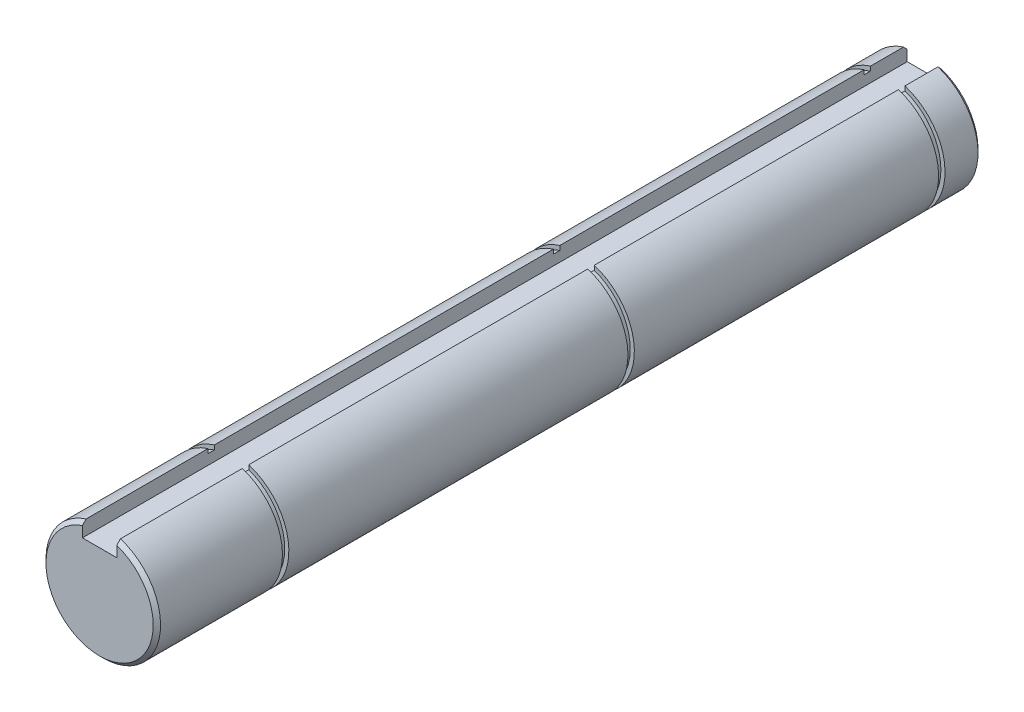
ISO-10303-21;
HEADER;
FILE_DESCRIPTION(('STEP AP214'),'2;1');
FILE_NAME('part.step','',(''),(''),'','','');
FILE_SCHEMA(('AUTOMOTIVE_DESIGN { 1 0 10303 214 1 1 1 1 }'));
ENDSEC;
DATA;
#1=APPLICATION_CONTEXT('core data for automotive mechanical design processes');
#2=APPLICATION_PROTOCOL_DEFINITION('international standard','automotive_design',2000,#1);
#3=PRODUCT_CONTEXT('',#1,'mechanical');
#4=PRODUCT('Part','Part','',(#3));
#5=PRODUCT_RELATED_PRODUCT_CATEGORY('part','',(#4));
#6=PRODUCT_DEFINITION_FORMATION('','',#4);
#7=PRODUCT_DEFINITION_CONTEXT('part definition',#1,'design');
#8=PRODUCT_DEFINITION('design','',#6,#7);
#9=PRODUCT_DEFINITION_SHAPE('','',#8);
#10=(LENGTH_UNIT() NAMED_UNIT(*) SI_UNIT(.MILLI.,.METRE.));
#11=(NAMED_UNIT(*) PLANE_ANGLE_UNIT() SI_UNIT($,.RADIAN.));
#12=(NAMED_UNIT(*) SI_UNIT($,.STERADIAN.) SOLID_ANGLE_UNIT());
#13=UNCERTAINTY_MEASURE_WITH_UNIT(LENGTH_MEASURE(1.E-05),#10,'distance_accuracy_value','');
#14=(GEOMETRIC_REPRESENTATION_CONTEXT(3) GLOBAL_UNCERTAINTY_ASSIGNED_CONTEXT((#13)) GLOBAL_UNIT_ASSIGNED_CONTEXT((#10,
#11,#12)) REPRESENTATION_CONTEXT('',''));
#15=CARTESIAN_POINT('',(0.,0.,0.));
#16=DIRECTION('',(0.,0.,1.));
#17=DIRECTION('',(1.,0.,0.));
#18=AXIS2_PLACEMENT_3D('',#15,#16,#17);
#19=CARTESIAN_POINT('',(-2.38125,0.,114.3));
#20=DIRECTION('',(1.,0.,0.));
#21=DIRECTION('',(0.,0.,-1.));
#22=AXIS2_PLACEMENT_3D('',#19,#20,#21);
#23=PLANE('',#22);
#24=DIRECTION('',(0.,0.,-1.));
#25=VECTOR('',#24,1.);
#26=CARTESIAN_POINT('',(-2.38125,7.57189241124701,114.3));
#27=LINE('',#26,#25);
#28=CARTESIAN_POINT('',(-2.38125,7.57189241124701,96.012));
#29=VERTEX_POINT('',#28);
#30=CARTESIAN_POINT('',(-2.38125,7.57189241124701,49.022));
#31=VERTEX_POINT('',#30);
#32=EDGE_CURVE('E257',#29,#31,#27,.T.);
#33=ORIENTED_EDGE('',*,*,#32,.F.);
#34=DIRECTION('',(0.,-1.,0.));
#35=VECTOR('',#34,1.);
#36=CARTESIAN_POINT('',(-2.38125,0.,96.012));
#37=LINE('',#36,#35);
#38=CARTESIAN_POINT('',(-2.38125,6.97048093301316,96.012));
#39=VERTEX_POINT('',#38);
#40=EDGE_CURVE('E187',#29,#39,#37,.T.);
#41=ORIENTED_EDGE('',*,*,#40,.T.);
#42=DIRECTION('',(0.,0.,1.));
#43=VECTOR('',#42,1.);
#44=CARTESIAN_POINT('',(-2.38125,6.97048093301316,96.012));
#45=LINE('',#44,#43);
#46=CARTESIAN_POINT('',(-2.38125,6.97048093301316,96.901));
#47=VERTEX_POINT('',#46);
#48=EDGE_CURVE('E190',#39,#47,#45,.T.);
#49=ORIENTED_EDGE('',*,*,#48,.T.);
#50=DIRECTION('',(0.,-1.,0.));
#51=VECTOR('',#50,1.);
#52=CARTESIAN_POINT('',(-2.38125,0.,96.901));
#53=LINE('',#52,#51);
#54=CARTESIAN_POINT('',(-2.38125,7.57189241124701,96.901));
#55=VERTEX_POINT('',#54);
#56=EDGE_CURVE('E175',#55,#47,#53,.T.);
#57=ORIENTED_EDGE('',*,*,#56,.F.);
#58=CARTESIAN_POINT('',(-2.38125,7.57189241124701,113.792));
#59=VERTEX_POINT('',#58);
#60=EDGE_CURVE('E253',#59,#55,#27,.T.);
#61=ORIENTED_EDGE('',*,*,#60,.F.);
#62=CARTESIAN_POINT('',(-2.38125,7.57189241124701,113.792));
#63=CARTESIAN_POINT('',(-2.38125,7.48298415469661,113.876823082422));
#64=CARTESIAN_POINT('',(-2.38125,7.39400154470862,113.96156795589));
#65=CARTESIAN_POINT('',(-2.38125,7.21588761331624,114.130901289231));
#66=CARTESIAN_POINT('',(-2.38125,7.12675629190426,114.215489749097));
#67=CARTESIAN_POINT('',(-2.38125,7.03755061704712,114.3));
#68=B_SPLINE_CURVE_WITH_KNOTS('',3,(#62,#63,#64,#65,#66,#67),.UNSPECIFIED.,.F.,.F.,(4,2,4),(0.,
0.368641270252204,0.737282559302373),.UNSPECIFIED.);
#69=CARTESIAN_POINT('',(-2.38125,7.03755061704712,114.3));
#70=VERTEX_POINT('',#69);
#71=EDGE_CURVE('E297',#59,#70,#68,.T.);
#72=ORIENTED_EDGE('',*,*,#71,.T.);
#73=DIRECTION('',(0.,-1.,0.));
#74=VECTOR('',#73,1.);
#75=CARTESIAN_POINT('',(-2.38125,0.,114.3));
#76=LINE('',#75,#74);
#77=CARTESIAN_POINT('',(-2.38125,5.55625,114.3));
#78=VERTEX_POINT('',#77);
#79=EDGE_CURVE('E230',#70,#78,#76,.T.);
#80=ORIENTED_EDGE('',*,*,#79,.T.);
#81=DIRECTION('',(0.,0.,-1.));
#82=VECTOR('',#81,1.);
#83=CARTESIAN_POINT('',(-2.38125,5.55625,114.3));
#84=LINE('',#83,#82);
#85=CARTESIAN_POINT('',(-2.38125,5.55625,0.));
#86=VERTEX_POINT('',#85);
#87=EDGE_CURVE('E238',#78,#86,#84,.T.);
#88=ORIENTED_EDGE('',*,*,#87,.T.);
#89=DIRECTION('',(0.,-1.,0.));
#90=VECTOR('',#89,1.);
#91=CARTESIAN_POINT('',(-2.38125,0.,0.));
#92=LINE('',#91,#90);
#93=CARTESIAN_POINT('',(-2.38125,7.03755061704709,0.));
#94=VERTEX_POINT('',#93);
#95=EDGE_CURVE('E229',#94,#86,#92,.T.);
#96=ORIENTED_EDGE('',*,*,#95,.F.);
#97=CARTESIAN_POINT('',(-2.38125,7.03755061704709,0.));
#98=CARTESIAN_POINT('',(-2.38125,7.12675629190424,0.0845102509029835));
#99=CARTESIAN_POINT('',(-2.38125,7.21588761331622,0.169098710769145));
#100=CARTESIAN_POINT('',(-2.38125,7.39400154470861,0.338432044110452));
#101=CARTESIAN_POINT('',(-2.38125,7.4829841546966,0.423176917577623));
#102=CARTESIAN_POINT('',(-2.38125,7.57189241124701,0.507999999999994));
#103=B_SPLINE_CURVE_WITH_KNOTS('',3,(#97,#98,#99,#100,#101,#102),.UNSPECIFIED.,.F.,.F.,(4,2,4),
(0.,0.368641289050182,0.737282559302403),.UNSPECIFIED.);
#104=CARTESIAN_POINT('',(-2.38125,7.57189241124701,0.507999999999994));
#105=VERTEX_POINT('',#104);
#106=EDGE_CURVE('E291',#94,#105,#103,.T.);
#107=ORIENTED_EDGE('',*,*,#106,.T.);
#108=CARTESIAN_POINT('',(-2.38125,7.57189241124701,5.08));
#109=VERTEX_POINT('',#108);
#110=EDGE_CURVE('E251',#109,#105,#27,.T.);
#111=ORIENTED_EDGE('',*,*,#110,.F.);
#112=DIRECTION('',(0.,1.,0.));
#113=VECTOR('',#112,1.);
#114=CARTESIAN_POINT('',(-2.38125,0.,5.08));
#115=LINE('',#114,#113);
#116=CARTESIAN_POINT('',(-2.38125,6.97048093301316,5.08));
#117=VERTEX_POINT('',#116);
#118=EDGE_CURVE('E221',#117,#109,#115,.T.);
#119=ORIENTED_EDGE('',*,*,#118,.F.);
#120=DIRECTION('',(0.,0.,-1.));
#121=VECTOR('',#120,1.);
#122=CARTESIAN_POINT('',(-2.38125,6.97048093301316,5.969));
#123=LINE('',#122,#121);
#124=CARTESIAN_POINT('',(-2.38125,6.97048093301316,5.969));
#125=VERTEX_POINT('',#124);
#126=EDGE_CURVE('E213',#117,#125,#123,.F.);
#127=ORIENTED_EDGE('',*,*,#126,.T.);
#128=DIRECTION('',(0.,1.,0.));
#129=VECTOR('',#128,1.);
#130=CARTESIAN_POINT('',(-2.38125,0.,5.969));
#131=LINE('',#130,#129);
#132=CARTESIAN_POINT('',(-2.38125,7.57189241124701,5.969));
#133=VERTEX_POINT('',#132);
#134=EDGE_CURVE('E226',#125,#133,#131,.T.);
#135=ORIENTED_EDGE('',*,*,#134,.T.);
#136=CARTESIAN_POINT('',(-2.38125,7.57189241124701,48.133));
#137=VERTEX_POINT('',#136);
#138=EDGE_CURVE('E521',#137,#133,#27,.T.);
#139=ORIENTED_EDGE('',*,*,#138,.F.);
#140=DIRECTION('',(0.,-1.,0.));
#141=VECTOR('',#140,1.);
#142=CARTESIAN_POINT('',(-2.38125,0.,48.133));
#143=LINE('',#142,#141);
#144=CARTESIAN_POINT('',(-2.38125,6.97048093301316,48.133));
#145=VERTEX_POINT('',#144);
#146=EDGE_CURVE('E206',#137,#145,#143,.T.);
#147=ORIENTED_EDGE('',*,*,#146,.T.);
#148=DIRECTION('',(0.,0.,1.));
#149=VECTOR('',#148,1.);
#150=CARTESIAN_POINT('',(-2.38125,6.97048093301316,48.133));
#151=LINE('',#150,#149);
#152=CARTESIAN_POINT('',(-2.38125,6.97048093301316,49.022));
#153=VERTEX_POINT('',#152);
#154=EDGE_CURVE('E194',#145,#153,#151,.T.);
#155=ORIENTED_EDGE('',*,*,#154,.T.);
#156=DIRECTION('',(0.,-1.,0.));
#157=VECTOR('',#156,1.);
#158=CARTESIAN_POINT('',(-2.38125,0.,49.022));
#159=LINE('',#158,#157);
#160=EDGE_CURVE('E202',#31,#153,#159,.T.);
#161=ORIENTED_EDGE('',*,*,#160,.F.);
#162=EDGE_LOOP('',(#33,#41,#49,#57,#61,#72,#80,#88,#96,#107,#111,#119,#127,#135,#139,#147,#155,#161));
#163=FACE_BOUND('',#162,.T.);
#164=ADVANCED_FACE('F39',(#163),#23,.T.);
#165=CARTESIAN_POINT('',(2.38125,0.,114.3));
#166=DIRECTION('',(1.,0.,0.));
#167=DIRECTION('',(0.,1.,0.));
#168=AXIS2_PLACEMENT_3D('',#165,#166,#167);
#169=PLANE('',#168);
#170=DIRECTION('',(0.,-1.,0.));
#171=VECTOR('',#170,1.);
#172=CARTESIAN_POINT('',(2.38125,0.,96.012));
#173=LINE('',#172,#171);
#174=CARTESIAN_POINT('',(2.38125,7.57189241124701,96.012));
#175=VERTEX_POINT('',#174);
#176=CARTESIAN_POINT('',(2.38125,6.97048093301316,96.012));
#177=VERTEX_POINT('',#176);
#178=EDGE_CURVE('E182',#175,#177,#173,.T.);
#179=ORIENTED_EDGE('',*,*,#178,.F.);
#180=DIRECTION('',(0.,0.,-1.));
#181=VECTOR('',#180,1.);
#182=CARTESIAN_POINT('',(2.38125,7.57189241124701,114.3));
#183=LINE('',#182,#181);
#184=CARTESIAN_POINT('',(2.38125,7.57189241124701,49.022));
#185=VERTEX_POINT('',#184);
#186=EDGE_CURVE('E252',#175,#185,#183,.T.);
#187=ORIENTED_EDGE('',*,*,#186,.T.);
#188=DIRECTION('',(0.,-1.,0.));
#189=VECTOR('',#188,1.);
#190=CARTESIAN_POINT('',(2.38125,0.,49.022));
#191=LINE('',#190,#189);
#192=CARTESIAN_POINT('',(2.38125,6.97048093301316,49.022));
#193=VERTEX_POINT('',#192);
#194=EDGE_CURVE('E314',#185,#193,#191,.T.);
#195=ORIENTED_EDGE('',*,*,#194,.T.);
#196=DIRECTION('',(0.,0.,1.));
#197=VECTOR('',#196,1.);
#198=CARTESIAN_POINT('',(2.38125,6.97048093301316,48.133));
#199=LINE('',#198,#197);
#200=CARTESIAN_POINT('',(2.38125,6.97048093301316,48.133));
#201=VERTEX_POINT('',#200);
#202=EDGE_CURVE('E312',#201,#193,#199,.T.);
#203=ORIENTED_EDGE('',*,*,#202,.F.);
#204=DIRECTION('',(0.,-1.,0.));
#205=VECTOR('',#204,1.);
#206=CARTESIAN_POINT('',(2.38125,0.,48.133));
#207=LINE('',#206,#205);
#208=CARTESIAN_POINT('',(2.38125,7.57189241124701,48.133));
#209=VERTEX_POINT('',#208);
#210=EDGE_CURVE('E317',#209,#201,#207,.T.);
#211=ORIENTED_EDGE('',*,*,#210,.F.);
#212=CARTESIAN_POINT('',(2.38125,7.57189241124701,5.969));
#213=VERTEX_POINT('',#212);
#214=EDGE_CURVE('E328',#209,#213,#183,.T.);
#215=ORIENTED_EDGE('',*,*,#214,.T.);
#216=DIRECTION('',(0.,1.,0.));
#217=VECTOR('',#216,1.);
#218=CARTESIAN_POINT('',(2.38125,0.,5.969));
#219=LINE('',#218,#217);
#220=CARTESIAN_POINT('',(2.38125,6.97048093301316,5.969));
#221=VERTEX_POINT('',#220);
#222=EDGE_CURVE('E309',#221,#213,#219,.T.);
#223=ORIENTED_EDGE('',*,*,#222,.F.);
#224=DIRECTION('',(0.,0.,-1.));
#225=VECTOR('',#224,1.);
#226=CARTESIAN_POINT('',(2.38125,6.97048093301316,5.969));
#227=LINE('',#226,#225);
#228=CARTESIAN_POINT('',(2.38125,6.97048093301316,5.08));
#229=VERTEX_POINT('',#228);
#230=EDGE_CURVE('E304',#229,#221,#227,.F.);
#231=ORIENTED_EDGE('',*,*,#230,.F.);
#232=DIRECTION('',(0.,1.,0.));
#233=VECTOR('',#232,1.);
#234=CARTESIAN_POINT('',(2.38125,0.,5.08));
#235=LINE('',#234,#233);
#236=CARTESIAN_POINT('',(2.38125,7.57189241124701,5.08));
#237=VERTEX_POINT('',#236);
#238=EDGE_CURVE('E306',#229,#237,#235,.T.);
#239=ORIENTED_EDGE('',*,*,#238,.T.);
#240=CARTESIAN_POINT('',(2.38125,7.57189241124701,0.507999999999994));
#241=VERTEX_POINT('',#240);
#242=EDGE_CURVE('E249',#237,#241,#183,.T.);
#243=ORIENTED_EDGE('',*,*,#242,.T.);
#244=CARTESIAN_POINT('',(2.38125,7.57189241124701,0.507999999999995));
#245=CARTESIAN_POINT('',(2.38125,7.4829841546966,0.423176917577623));
#246=CARTESIAN_POINT('',(2.38125,7.39400154470861,0.338432044110453));
#247=CARTESIAN_POINT('',(2.38125,7.21588761331623,0.169098710769145));
#248=CARTESIAN_POINT('',(2.38125,7.12675629190424,0.0845102509029838));
#249=CARTESIAN_POINT('',(2.38125,7.03755061704709,0.));
#250=B_SPLINE_CURVE_WITH_KNOTS('',3,(#244,#245,#246,#247,#248,#249),.UNSPECIFIED.,.F.,.F.,(4,2,
4),(0.,0.368641270252221,0.737282559302403),.UNSPECIFIED.);
#251=CARTESIAN_POINT('',(2.38125,7.03755061704709,0.));
#252=VERTEX_POINT('',#251);
#253=EDGE_CURVE('E260',#241,#252,#250,.T.);
#254=ORIENTED_EDGE('',*,*,#253,.T.);
#255=DIRECTION('',(0.,-1.,0.));
#256=VECTOR('',#255,1.);
#257=CARTESIAN_POINT('',(2.38125,0.,0.));
#258=LINE('',#257,#256);
#259=CARTESIAN_POINT('',(2.38125,5.55625,0.));
#260=VERTEX_POINT('',#259);
#261=EDGE_CURVE('E240',#252,#260,#258,.T.);
#262=ORIENTED_EDGE('',*,*,#261,.T.);
#263=DIRECTION('',(0.,0.,-1.));
#264=VECTOR('',#263,1.);
#265=CARTESIAN_POINT('',(2.38125,5.55625,114.3));
#266=LINE('',#265,#264);
#267=CARTESIAN_POINT('',(2.38125,5.55625,114.3));
#268=VERTEX_POINT('',#267);
#269=EDGE_CURVE('E246',#268,#260,#266,.T.);
#270=ORIENTED_EDGE('',*,*,#269,.F.);
#271=DIRECTION('',(0.,-1.,0.));
#272=VECTOR('',#271,1.);
#273=CARTESIAN_POINT('',(2.38125,0.,114.3));
#274=LINE('',#273,#272);
#275=CARTESIAN_POINT('',(2.38125,7.03755061704712,114.3));
#276=VERTEX_POINT('',#275);
#277=EDGE_CURVE('E232',#276,#268,#274,.T.);
#278=ORIENTED_EDGE('',*,*,#277,.F.);
#279=CARTESIAN_POINT('',(2.38125,7.03755061704712,114.3));
#280=CARTESIAN_POINT('',(2.38125,7.12675629190427,114.215489749097));
#281=CARTESIAN_POINT('',(2.38125,7.21588761331625,114.130901289231));
#282=CARTESIAN_POINT('',(2.38125,7.39400154470863,113.96156795589));
#283=CARTESIAN_POINT('',(2.38125,7.48298415469661,113.876823082422));
#284=CARTESIAN_POINT('',(2.38125,7.57189241124701,113.792));
#285=B_SPLINE_CURVE_WITH_KNOTS('',3,(#279,#280,#281,#282,#283,#284),.UNSPECIFIED.,.F.,.F.,(4,2,
4),(0.,0.36864128905017,0.737282559302376),.UNSPECIFIED.);
#286=CARTESIAN_POINT('',(2.38125,7.57189241124701,113.792));
#287=VERTEX_POINT('',#286);
#288=EDGE_CURVE('E266',#276,#287,#285,.T.);
#289=ORIENTED_EDGE('',*,*,#288,.T.);
#290=CARTESIAN_POINT('',(2.38125,7.57189241124701,96.901));
#291=VERTEX_POINT('',#290);
#292=EDGE_CURVE('E180',#287,#291,#183,.T.);
#293=ORIENTED_EDGE('',*,*,#292,.T.);
#294=DIRECTION('',(0.,-1.,0.));
#295=VECTOR('',#294,1.);
#296=CARTESIAN_POINT('',(2.38125,0.,96.901));
#297=LINE('',#296,#295);
#298=CARTESIAN_POINT('',(2.38125,6.97048093301316,96.901));
#299=VERTEX_POINT('',#298);
#300=EDGE_CURVE('E55',#291,#299,#297,.T.);
#301=ORIENTED_EDGE('',*,*,#300,.T.);
#302=DIRECTION('',(0.,0.,1.));
#303=VECTOR('',#302,1.);
#304=CARTESIAN_POINT('',(2.38125,6.97048093301316,96.012));
#305=LINE('',#304,#303);
#306=EDGE_CURVE('E12',#177,#299,#305,.T.);
#307=ORIENTED_EDGE('',*,*,#306,.F.);
#308=EDGE_LOOP('',(#179,#187,#195,#203,#211,#215,#223,#231,#239,#243,#254,#262,#270,#278,#289,
#293,#301,#307));
#309=FACE_BOUND('',#308,.T.);
#310=ADVANCED_FACE('F178',(#309),#169,.F.);
#311=CARTESIAN_POINT('',(0.,0.,114.3));
#312=DIRECTION('',(0.,0.,-1.));
#313=DIRECTION('',(-1.,0.,0.));
#314=AXIS2_PLACEMENT_3D('',#311,#312,#313);
#315=CYLINDRICAL_SURFACE('',#314,7.9375);
#316=CARTESIAN_POINT('',(0.,0.,96.012));
#317=DIRECTION('',(0.,0.,1.));
#318=DIRECTION('',(1.,0.,0.));
#319=AXIS2_PLACEMENT_3D('',#316,#317,#318);
#320=CIRCLE('',#319,7.9375);
#321=EDGE_CURVE('E48',#29,#175,#320,.T.);
#322=ORIENTED_EDGE('',*,*,#321,.F.);
#323=ORIENTED_EDGE('',*,*,#32,.T.);
#324=CARTESIAN_POINT('',(0.,0.,49.022));
#325=DIRECTION('',(0.,0.,1.));
#326=DIRECTION('',(1.,0.,0.));
#327=AXIS2_PLACEMENT_3D('',#324,#325,#326);
#328=CIRCLE('',#327,7.9375);
#329=EDGE_CURVE('E199',#31,#185,#328,.T.);
#330=ORIENTED_EDGE('',*,*,#329,.T.);
#331=ORIENTED_EDGE('',*,*,#186,.F.);
#332=EDGE_LOOP('',(#322,#323,#330,#331));
#333=FACE_BOUND('',#332,.T.);
#334=ADVANCED_FACE('F275',(#333),#315,.T.);
#335=CARTESIAN_POINT('',(0.,0.,48.133));
#336=DIRECTION('',(0.,0.,1.));
#337=DIRECTION('',(1.,0.,0.));
#338=AXIS2_PLACEMENT_3D('',#335,#336,#337);
#339=CIRCLE('',#338,7.9375);
#340=EDGE_CURVE('E204',#137,#209,#339,.T.);
#341=ORIENTED_EDGE('',*,*,#340,.F.);
#342=ORIENTED_EDGE('',*,*,#138,.T.);
#343=CARTESIAN_POINT('',(0.,0.,5.969));
#344=DIRECTION('',(0.,0.,-1.));
#345=DIRECTION('',(-1.,0.,0.));
#346=AXIS2_PLACEMENT_3D('',#343,#344,#345);
#347=CIRCLE('',#346,7.9375);
#348=EDGE_CURVE('E223',#213,#133,#347,.T.);
#349=ORIENTED_EDGE('',*,*,#348,.F.);
#350=ORIENTED_EDGE('',*,*,#214,.F.);
#351=EDGE_LOOP('',(#341,#342,#349,#350));
#352=FACE_BOUND('',#351,.T.);
#353=ADVANCED_FACE('F442',(#352),#315,.T.);
#354=ORIENTED_EDGE('',*,*,#60,.T.);
#355=CARTESIAN_POINT('',(0.,0.,96.901));
#356=DIRECTION('',(0.,0.,1.));
#357=DIRECTION('',(1.,0.,0.));
#358=AXIS2_PLACEMENT_3D('',#355,#356,#357);
#359=CIRCLE('',#358,7.9375);
#360=EDGE_CURVE('E319',#55,#291,#359,.T.);
#361=ORIENTED_EDGE('',*,*,#360,.T.);
#362=ORIENTED_EDGE('',*,*,#292,.F.);
#363=CARTESIAN_POINT('',(0.,0.,113.792));
#364=DIRECTION('',(0.,0.,1.));
#365=DIRECTION('',(1.,0.,0.));
#366=AXIS2_PLACEMENT_3D('',#363,#364,#365);
#367=CIRCLE('',#366,7.9375);
#368=EDGE_CURVE('E345',#287,#59,#367,.F.);
#369=ORIENTED_EDGE('',*,*,#368,.T.);
#370=EDGE_LOOP('',(#354,#361,#362,#369));
#371=FACE_BOUND('',#370,.T.);
#372=ADVANCED_FACE('F282',(#371),#315,.T.);
#373=ORIENTED_EDGE('',*,*,#242,.F.);
#374=CARTESIAN_POINT('',(0.,0.,5.08));
#375=DIRECTION('',(0.,0.,-1.));
#376=DIRECTION('',(-1.,0.,0.));
#377=AXIS2_PLACEMENT_3D('',#374,#375,#376);
#378=CIRCLE('',#377,7.9375);
#379=EDGE_CURVE('E218',#237,#109,#378,.T.);
#380=ORIENTED_EDGE('',*,*,#379,.T.);
#381=ORIENTED_EDGE('',*,*,#110,.T.);
#382=CARTESIAN_POINT('',(0.,0.,0.507999999999995));
#383=DIRECTION('',(0.,0.,1.));
#384=DIRECTION('',(1.,0.,0.));
#385=AXIS2_PLACEMENT_3D('',#382,#383,#384);
#386=CIRCLE('',#385,7.9375);
#387=EDGE_CURVE('E342',#105,#241,#386,.T.);
#388=ORIENTED_EDGE('',*,*,#387,.T.);
#389=EDGE_LOOP('',(#373,#380,#381,#388));
#390=FACE_BOUND('',#389,.T.);
#391=ADVANCED_FACE('F278',(#390),#315,.T.);
#392=CARTESIAN_POINT('',(0.,5.55625,114.3));
#393=DIRECTION('',(0.,-1.,0.));
#394=DIRECTION('',(1.,0.,0.));
#395=AXIS2_PLACEMENT_3D('',#392,#393,#394);
#396=PLANE('',#395);
#397=DIRECTION('',(-1.,0.,0.));
#398=VECTOR('',#397,1.);
#399=CARTESIAN_POINT('',(0.,5.55625,0.));
#400=LINE('',#399,#398);
#401=EDGE_CURVE('E233',#260,#86,#400,.T.);
#402=ORIENTED_EDGE('',*,*,#401,.T.);
#403=ORIENTED_EDGE('',*,*,#87,.F.);
#404=DIRECTION('',(-1.,0.,0.));
#405=VECTOR('',#404,1.);
#406=CARTESIAN_POINT('',(0.,5.55625,114.3));
#407=LINE('',#406,#405);
#408=EDGE_CURVE('E235',#268,#78,#407,.T.);
#409=ORIENTED_EDGE('',*,*,#408,.F.);
#410=ORIENTED_EDGE('',*,*,#269,.T.);
#411=EDGE_LOOP('',(#402,#403,#409,#410));
#412=FACE_BOUND('',#411,.T.);
#413=ADVANCED_FACE('F276',(#412),#396,.F.);
#414=CARTESIAN_POINT('',(0.,0.,114.3));
#415=DIRECTION('',(0.,0.,1.));
#416=DIRECTION('',(1.,0.,0.));
#417=AXIS2_PLACEMENT_3D('',#414,#415,#416);
#418=PLANE('',#417);
#419=ORIENTED_EDGE('',*,*,#79,.F.);
#420=CARTESIAN_POINT('',(0.,0.,114.3));
#421=DIRECTION('',(0.,0.,1.));
#422=DIRECTION('',(1.,0.,0.));
#423=AXIS2_PLACEMENT_3D('',#420,#421,#422);
#424=CIRCLE('',#423,7.42950000000002);
#425=EDGE_CURVE('E256',#70,#276,#424,.T.);
#426=ORIENTED_EDGE('',*,*,#425,.T.);
#427=ORIENTED_EDGE('',*,*,#277,.T.);
#428=ORIENTED_EDGE('',*,*,#408,.T.);
#429=EDGE_LOOP('',(#419,#426,#427,#428));
#430=FACE_BOUND('',#429,.T.);
#431=ADVANCED_FACE('F356',(#430),#418,.T.);
#432=CARTESIAN_POINT('',(0.,0.,0.));
#433=DIRECTION('',(0.,0.,1.));
#434=DIRECTION('',(1.,0.,0.));
#435=AXIS2_PLACEMENT_3D('',#432,#433,#434);
#436=PLANE('',#435);
#437=ORIENTED_EDGE('',*,*,#261,.F.);
#438=CARTESIAN_POINT('',(0.,0.,0.));
#439=DIRECTION('',(0.,0.,1.));
#440=DIRECTION('',(1.,0.,0.));
#441=AXIS2_PLACEMENT_3D('',#438,#439,#440);
#442=CIRCLE('',#441,7.42949999999999);
#443=EDGE_CURVE('E302',#252,#94,#442,.F.);
#444=ORIENTED_EDGE('',*,*,#443,.T.);
#445=ORIENTED_EDGE('',*,*,#95,.T.);
#446=ORIENTED_EDGE('',*,*,#401,.F.);
#447=EDGE_LOOP('',(#437,#444,#445,#446));
#448=FACE_BOUND('',#447,.T.);
#449=ADVANCED_FACE('F363',(#448),#436,.F.);
#450=CARTESIAN_POINT('',(0.,0.,114.3));
#451=DIRECTION('',(0.,0.,-1.));
#452=DIRECTION('',(-1.,0.,0.));
#453=AXIS2_PLACEMENT_3D('',#450,#451,#452);
#454=CONICAL_SURFACE('',#453,7.42950000000002,0.78539816339745);
#455=ORIENTED_EDGE('',*,*,#71,.F.);
#456=ORIENTED_EDGE('',*,*,#368,.F.);
#457=ORIENTED_EDGE('',*,*,#288,.F.);
#458=ORIENTED_EDGE('',*,*,#425,.F.);
#459=EDGE_LOOP('',(#455,#456,#457,#458));
#460=FACE_BOUND('',#459,.T.);
#461=ADVANCED_FACE('F287',(#460),#454,.T.);
#462=CARTESIAN_POINT('',(0.,0.,0.507999999999995));
#463=DIRECTION('',(0.,0.,1.));
#464=DIRECTION('',(1.,0.,0.));
#465=AXIS2_PLACEMENT_3D('',#462,#463,#464);
#466=CONICAL_SURFACE('',#465,7.9375,0.785398163397464);
#467=ORIENTED_EDGE('',*,*,#106,.F.);
#468=ORIENTED_EDGE('',*,*,#443,.F.);
#469=ORIENTED_EDGE('',*,*,#253,.F.);
#470=ORIENTED_EDGE('',*,*,#387,.F.);
#471=EDGE_LOOP('',(#467,#468,#469,#470));
#472=FACE_BOUND('',#471,.T.);
#473=ADVANCED_FACE('F41',(#472),#466,.T.);
#474=CARTESIAN_POINT('',(0.,0.,5.969));
#475=DIRECTION('',(0.,0.,-1.));
#476=DIRECTION('',(-1.,0.,0.));
#477=AXIS2_PLACEMENT_3D('',#474,#475,#476);
#478=PLANE('',#477);
#479=CARTESIAN_POINT('',(0.,0.,5.969));
#480=DIRECTION('',(0.,0.,-1.));
#481=DIRECTION('',(-1.,0.,0.));
#482=AXIS2_PLACEMENT_3D('',#479,#480,#481);
#483=CIRCLE('',#482,7.366);
#484=EDGE_CURVE('E210',#221,#125,#483,.T.);
#485=ORIENTED_EDGE('',*,*,#484,.F.);
#486=ORIENTED_EDGE('',*,*,#222,.T.);
#487=ORIENTED_EDGE('',*,*,#348,.T.);
#488=ORIENTED_EDGE('',*,*,#134,.F.);
#489=EDGE_LOOP('',(#485,#486,#487,#488));
#490=FACE_BOUND('',#489,.T.);
#491=ADVANCED_FACE('F375',(#490),#478,.T.);
#492=CARTESIAN_POINT('',(0.,0.,5.08));
#493=DIRECTION('',(0.,0.,-1.));
#494=DIRECTION('',(-1.,0.,0.));
#495=AXIS2_PLACEMENT_3D('',#492,#493,#494);
#496=PLANE('',#495);
#497=ORIENTED_EDGE('',*,*,#118,.T.);
#498=ORIENTED_EDGE('',*,*,#379,.F.);
#499=ORIENTED_EDGE('',*,*,#238,.F.);
#500=CARTESIAN_POINT('',(0.,0.,5.08));
#501=DIRECTION('',(0.,0.,-1.));
#502=DIRECTION('',(-1.,0.,0.));
#503=AXIS2_PLACEMENT_3D('',#500,#501,#502);
#504=CIRCLE('',#503,7.366);
#505=EDGE_CURVE('E209',#229,#117,#504,.T.);
#506=ORIENTED_EDGE('',*,*,#505,.T.);
#507=EDGE_LOOP('',(#497,#498,#499,#506));
#508=FACE_BOUND('',#507,.T.);
#509=ADVANCED_FACE('F371',(#508),#496,.F.);
#510=CARTESIAN_POINT('',(0.,0.,5.969));
#511=DIRECTION('',(0.,0.,-1.));
#512=DIRECTION('',(-1.,0.,0.));
#513=AXIS2_PLACEMENT_3D('',#510,#511,#512);
#514=CYLINDRICAL_SURFACE('',#513,7.366);
#515=ORIENTED_EDGE('',*,*,#505,.F.);
#516=ORIENTED_EDGE('',*,*,#230,.T.);
#517=ORIENTED_EDGE('',*,*,#484,.T.);
#518=ORIENTED_EDGE('',*,*,#126,.F.);
#519=EDGE_LOOP('',(#515,#516,#517,#518));
#520=FACE_BOUND('',#519,.T.);
#521=ADVANCED_FACE('F374',(#520),#514,.T.);
#522=CARTESIAN_POINT('',(0.,-0.182803794376497,48.133));
#523=DIRECTION('',(0.,0.,1.));
#524=DIRECTION('',(1.,0.,0.));
#525=AXIS2_PLACEMENT_3D('',#522,#523,#524);
#526=PLANE('',#525);
#527=ORIENTED_EDGE('',*,*,#340,.T.);
#528=ORIENTED_EDGE('',*,*,#210,.T.);
#529=CARTESIAN_POINT('',(0.,0.,48.133));
#530=DIRECTION('',(0.,0.,1.));
#531=DIRECTION('',(1.,0.,0.));
#532=AXIS2_PLACEMENT_3D('',#529,#530,#531);
#533=CIRCLE('',#532,7.366);
#534=EDGE_CURVE('E63',#145,#201,#533,.T.);
#535=ORIENTED_EDGE('',*,*,#534,.F.);
#536=ORIENTED_EDGE('',*,*,#146,.F.);
#537=EDGE_LOOP('',(#527,#528,#535,#536));
#538=FACE_BOUND('',#537,.T.);
#539=ADVANCED_FACE('F382',(#538),#526,.T.);
#540=CARTESIAN_POINT('',(0.,-0.182803794376497,49.022));
#541=DIRECTION('',(0.,0.,1.));
#542=DIRECTION('',(1.,0.,0.));
#543=AXIS2_PLACEMENT_3D('',#540,#541,#542);
#544=PLANE('',#543);
#545=ORIENTED_EDGE('',*,*,#160,.T.);
#546=CARTESIAN_POINT('',(0.,0.,49.022));
#547=DIRECTION('',(0.,0.,1.));
#548=DIRECTION('',(1.,0.,0.));
#549=AXIS2_PLACEMENT_3D('',#546,#547,#548);
#550=CIRCLE('',#549,7.366);
#551=EDGE_CURVE('E192',#153,#193,#550,.T.);
#552=ORIENTED_EDGE('',*,*,#551,.T.);
#553=ORIENTED_EDGE('',*,*,#194,.F.);
#554=ORIENTED_EDGE('',*,*,#329,.F.);
#555=EDGE_LOOP('',(#545,#552,#553,#554));
#556=FACE_BOUND('',#555,.T.);
#557=ADVANCED_FACE('F384',(#556),#544,.F.);
#558=CARTESIAN_POINT('',(0.,0.,48.133));
#559=DIRECTION('',(0.,0.,1.));
#560=DIRECTION('',(1.,0.,0.));
#561=AXIS2_PLACEMENT_3D('',#558,#559,#560);
#562=CYLINDRICAL_SURFACE('',#561,7.366);
#563=ORIENTED_EDGE('',*,*,#534,.T.);
#564=ORIENTED_EDGE('',*,*,#202,.T.);
#565=ORIENTED_EDGE('',*,*,#551,.F.);
#566=ORIENTED_EDGE('',*,*,#154,.F.);
#567=EDGE_LOOP('',(#563,#564,#565,#566));
#568=FACE_BOUND('',#567,.T.);
#569=ADVANCED_FACE('F387',(#568),#562,.T.);
#570=CARTESIAN_POINT('',(0.,-0.182803794376497,96.012));
#571=DIRECTION('',(0.,0.,1.));
#572=DIRECTION('',(1.,0.,0.));
#573=AXIS2_PLACEMENT_3D('',#570,#571,#572);
#574=PLANE('',#573);
#575=ORIENTED_EDGE('',*,*,#321,.T.);
#576=ORIENTED_EDGE('',*,*,#178,.T.);
#577=CARTESIAN_POINT('',(0.,0.,96.012));
#578=DIRECTION('',(0.,0.,1.));
#579=DIRECTION('',(1.,0.,0.));
#580=AXIS2_PLACEMENT_3D('',#577,#578,#579);
#581=CIRCLE('',#580,7.366);
#582=EDGE_CURVE('E170',#39,#177,#581,.T.);
#583=ORIENTED_EDGE('',*,*,#582,.F.);
#584=ORIENTED_EDGE('',*,*,#40,.F.);
#585=EDGE_LOOP('',(#575,#576,#583,#584));
#586=FACE_BOUND('',#585,.T.);
#587=ADVANCED_FACE('F322',(#586),#574,.T.);
#588=CARTESIAN_POINT('',(0.,-0.182803794376497,96.901));
#589=DIRECTION('',(0.,0.,1.));
#590=DIRECTION('',(1.,0.,0.));
#591=AXIS2_PLACEMENT_3D('',#588,#589,#590);
#592=PLANE('',#591);
#593=ORIENTED_EDGE('',*,*,#56,.T.);
#594=CARTESIAN_POINT('',(0.,0.,96.901));
#595=DIRECTION('',(0.,0.,1.));
#596=DIRECTION('',(1.,0.,0.));
#597=AXIS2_PLACEMENT_3D('',#594,#595,#596);
#598=CIRCLE('',#597,7.366);
#599=EDGE_CURVE('E167',#47,#299,#598,.T.);
#600=ORIENTED_EDGE('',*,*,#599,.T.);
#601=ORIENTED_EDGE('',*,*,#300,.F.);
#602=ORIENTED_EDGE('',*,*,#360,.F.);
#603=EDGE_LOOP('',(#593,#600,#601,#602));
#604=FACE_BOUND('',#603,.T.);
#605=ADVANCED_FACE('F173',(#604),#592,.F.);
#606=CARTESIAN_POINT('',(0.,0.,96.012));
#607=DIRECTION('',(0.,0.,1.));
#608=DIRECTION('',(1.,0.,0.));
#609=AXIS2_PLACEMENT_3D('',#606,#607,#608);
#610=CYLINDRICAL_SURFACE('',#609,7.366);
#611=ORIENTED_EDGE('',*,*,#582,.T.);
#612=ORIENTED_EDGE('',*,*,#306,.T.);
#613=ORIENTED_EDGE('',*,*,#599,.F.);
#614=ORIENTED_EDGE('',*,*,#48,.F.);
#615=EDGE_LOOP('',(#611,#612,#613,#614));
#616=FACE_BOUND('',#615,.T.);
#617=ADVANCED_FACE('F166',(#616),#610,.T.);
#618=CLOSED_SHELL('',(#164,#310,#334,#353,#372,#391,#413,#431,#449,#461,#473,#491,#509,#521,
#539,#557,#569,#587,#605,#617));
#619=MANIFOLD_SOLID_BREP('B2',#618);
#620=ADVANCED_BREP_SHAPE_REPRESENTATION('',(#18,#619),#14);
#621=SHAPE_DEFINITION_REPRESENTATION(#9,#620);
ENDSEC;
END-ISO-10303-21;
